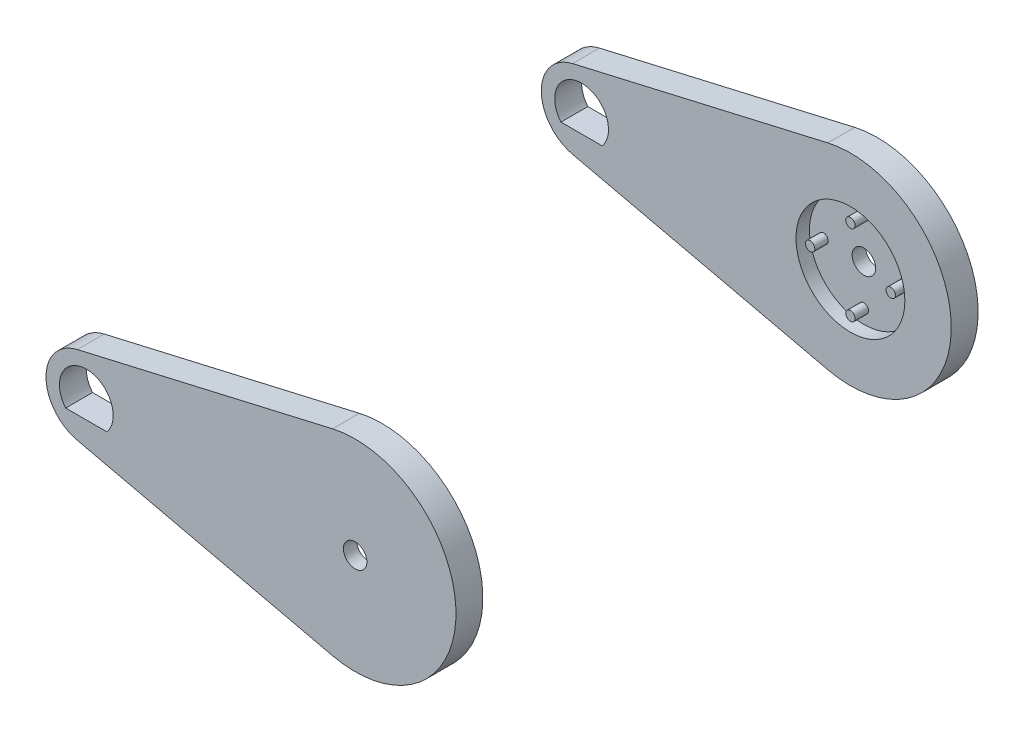
ISO-10303-21;
HEADER;
FILE_DESCRIPTION(('STEP AP214'),'2;1');
FILE_NAME('part.step','',(''),(''),'','','');
FILE_SCHEMA(('AUTOMOTIVE_DESIGN { 1 0 10303 214 1 1 1 1 }'));
ENDSEC;
DATA;
#1=APPLICATION_CONTEXT('core data for automotive mechanical design processes');
#2=APPLICATION_PROTOCOL_DEFINITION('international standard','automotive_design',2000,#1);
#3=PRODUCT_CONTEXT('',#1,'mechanical');
#4=PRODUCT('Part','Part','',(#3));
#5=PRODUCT_RELATED_PRODUCT_CATEGORY('part','',(#4));
#6=PRODUCT_DEFINITION_FORMATION('','',#4);
#7=PRODUCT_DEFINITION_CONTEXT('part definition',#1,'design');
#8=PRODUCT_DEFINITION('design','',#6,#7);
#9=PRODUCT_DEFINITION_SHAPE('','',#8);
#10=(LENGTH_UNIT() NAMED_UNIT(*) SI_UNIT(.MILLI.,.METRE.));
#11=(NAMED_UNIT(*) PLANE_ANGLE_UNIT() SI_UNIT($,.RADIAN.));
#12=(NAMED_UNIT(*) SI_UNIT($,.STERADIAN.) SOLID_ANGLE_UNIT());
#13=UNCERTAINTY_MEASURE_WITH_UNIT(LENGTH_MEASURE(1.E-05),#10,'distance_accuracy_value','');
#14=(GEOMETRIC_REPRESENTATION_CONTEXT(3) GLOBAL_UNCERTAINTY_ASSIGNED_CONTEXT((#13)) GLOBAL_UNIT_ASSIGNED_CONTEXT((#10,
#11,#12)) REPRESENTATION_CONTEXT('',''));
#15=CARTESIAN_POINT('',(0.,0.,0.));
#16=DIRECTION('',(0.,0.,1.));
#17=DIRECTION('',(1.,0.,0.));
#18=AXIS2_PLACEMENT_3D('',#15,#16,#17);
#19=CARTESIAN_POINT('',(0.,0.,73.6959896765683));
#20=DIRECTION('',(0.,0.,1.));
#21=DIRECTION('',(-1.,0.,0.));
#22=AXIS2_PLACEMENT_3D('',#19,#20,#21);
#23=CYLINDRICAL_SURFACE('',#22,15.);
#24=DIRECTION('',(0.,0.,1.));
#25=VECTOR('',#24,1.);
#26=CARTESIAN_POINT('',(-3.375,14.6153814524288,73.6959896765683));
#27=LINE('',#26,#25);
#28=CARTESIAN_POINT('',(-3.375,14.6153814524288,73.6959896765683));
#29=VERTEX_POINT('',#28);
#30=CARTESIAN_POINT('',(-3.375,14.6153814524288,77.6959896765683));
#31=VERTEX_POINT('',#30);
#32=EDGE_CURVE('E112',#29,#31,#27,.T.);
#33=ORIENTED_EDGE('',*,*,#32,.T.);
#34=CARTESIAN_POINT('',(0.,0.,77.6959896765683));
#35=DIRECTION('',(0.,0.,1.));
#36=DIRECTION('',(1.,0.,0.));
#37=AXIS2_PLACEMENT_3D('',#34,#35,#36);
#38=CIRCLE('',#37,15.);
#39=CARTESIAN_POINT('',(-3.375,-14.6153814524288,77.6959896765683));
#40=VERTEX_POINT('',#39);
#41=EDGE_CURVE('E153',#40,#31,#38,.T.);
#42=ORIENTED_EDGE('',*,*,#41,.F.);
#43=DIRECTION('',(0.,0.,1.));
#44=VECTOR('',#43,1.);
#45=CARTESIAN_POINT('',(-3.375,-14.6153814524288,73.6959896765683));
#46=LINE('',#45,#44);
#47=CARTESIAN_POINT('',(-3.375,-14.6153814524288,73.6959896765683));
#48=VERTEX_POINT('',#47);
#49=EDGE_CURVE('E131',#48,#40,#46,.T.);
#50=ORIENTED_EDGE('',*,*,#49,.F.);
#51=CARTESIAN_POINT('',(0.,0.,73.6959896765683));
#52=DIRECTION('',(0.,0.,1.));
#53=DIRECTION('',(1.,0.,0.));
#54=AXIS2_PLACEMENT_3D('',#51,#52,#53);
#55=CIRCLE('',#54,15.);
#56=EDGE_CURVE('E58',#48,#29,#55,.T.);
#57=ORIENTED_EDGE('',*,*,#56,.T.);
#58=EDGE_LOOP('',(#33,#42,#50,#57));
#59=FACE_BOUND('',#58,.T.);
#60=ADVANCED_FACE('F50',(#59),#23,.T.);
#61=CARTESIAN_POINT('',(0.,0.,73.6959896765683));
#62=DIRECTION('',(0.,0.,1.));
#63=DIRECTION('',(-1.,0.,0.));
#64=AXIS2_PLACEMENT_3D('',#61,#62,#63);
#65=CYLINDRICAL_SURFACE('',#64,8.1);
#66=CARTESIAN_POINT('',(0.,0.,75.6959896765683));
#67=DIRECTION('',(0.,0.,1.));
#68=DIRECTION('',(1.,0.,0.));
#69=AXIS2_PLACEMENT_3D('',#66,#67,#68);
#70=CIRCLE('',#69,8.1);
#71=CARTESIAN_POINT('',(8.1,0.,75.6959896765683));
#72=VERTEX_POINT('',#71);
#73=EDGE_CURVE('E12',#72,#72,#70,.T.);
#74=ORIENTED_EDGE('',*,*,#73,.T.);
#75=EDGE_LOOP('',(#74));
#76=FACE_BOUND('',#75,.T.);
#77=CARTESIAN_POINT('',(0.,0.,73.6959896765683));
#78=DIRECTION('',(0.,0.,1.));
#79=DIRECTION('',(1.,0.,0.));
#80=AXIS2_PLACEMENT_3D('',#77,#78,#79);
#81=CIRCLE('',#80,8.1);
#82=CARTESIAN_POINT('',(8.1,0.,73.6959896765683));
#83=VERTEX_POINT('',#82);
#84=EDGE_CURVE('E156',#83,#83,#81,.T.);
#85=ORIENTED_EDGE('',*,*,#84,.F.);
#86=EDGE_LOOP('',(#85));
#87=FACE_BOUND('',#86,.T.);
#88=ADVANCED_FACE('F52',(#76,#87),#65,.F.);
#89=CARTESIAN_POINT('',(0.,0.,73.6959896765683));
#90=DIRECTION('',(0.,0.,-1.));
#91=DIRECTION('',(1.,0.,0.));
#92=AXIS2_PLACEMENT_3D('',#89,#90,#91);
#93=PLANE('',#92);
#94=ORIENTED_EDGE('',*,*,#84,.T.);
#95=EDGE_LOOP('',(#94));
#96=FACE_BOUND('',#95,.T.);
#97=ORIENTED_EDGE('',*,*,#56,.F.);
#98=DIRECTION('',(0.974358763495254,-0.225,0.));
#99=VECTOR('',#98,1.);
#100=CARTESIAN_POINT('',(-3.375,-14.6153814524288,73.6959896765683));
#101=LINE('',#100,#99);
#102=CARTESIAN_POINT('',(-41.35,-5.84615258097153,73.6959896765683));
#103=VERTEX_POINT('',#102);
#104=EDGE_CURVE('E65',#103,#48,#101,.T.);
#105=ORIENTED_EDGE('',*,*,#104,.F.);
#106=CARTESIAN_POINT('',(-40.,0.,73.6959896765683));
#107=DIRECTION('',(0.,0.,1.));
#108=DIRECTION('',(1.,0.,0.));
#109=AXIS2_PLACEMENT_3D('',#106,#107,#108);
#110=CIRCLE('',#109,6.);
#111=CARTESIAN_POINT('',(-41.35,5.84615258097153,73.6959896765683));
#112=VERTEX_POINT('',#111);
#113=EDGE_CURVE('E107',#112,#103,#110,.T.);
#114=ORIENTED_EDGE('',*,*,#113,.F.);
#115=DIRECTION('',(0.974358763495254,0.225,0.));
#116=VECTOR('',#115,1.);
#117=CARTESIAN_POINT('',(-3.375,14.6153814524288,73.6959896765683));
#118=LINE('',#117,#116);
#119=EDGE_CURVE('E72',#112,#29,#118,.T.);
#120=ORIENTED_EDGE('',*,*,#119,.T.);
#121=EDGE_LOOP('',(#97,#105,#114,#120));
#122=FACE_BOUND('',#121,.T.);
#123=CARTESIAN_POINT('',(-40.,0.,73.6959896765683));
#124=DIRECTION('',(0.,0.,1.));
#125=DIRECTION('',(1.,0.,0.));
#126=AXIS2_PLACEMENT_3D('',#123,#124,#125);
#127=CIRCLE('',#126,4.);
#128=CARTESIAN_POINT('',(-36.925,-2.55819760769179,73.6959896765683));
#129=VERTEX_POINT('',#128);
#130=CARTESIAN_POINT('',(-43.075,-2.55819760769179,73.6959896765683));
#131=VERTEX_POINT('',#130);
#132=EDGE_CURVE('E123',#129,#131,#127,.T.);
#133=ORIENTED_EDGE('',*,*,#132,.T.);
#134=DIRECTION('',(1.,0.,0.));
#135=VECTOR('',#134,1.);
#136=CARTESIAN_POINT('',(0.,-2.55819760769179,73.6959896765683));
#137=LINE('',#136,#135);
#138=EDGE_CURVE('E128',#131,#129,#137,.T.);
#139=ORIENTED_EDGE('',*,*,#138,.T.);
#140=EDGE_LOOP('',(#133,#139));
#141=FACE_BOUND('',#140,.T.);
#142=ADVANCED_FACE('F120',(#96,#122,#141),#93,.T.);
#143=CARTESIAN_POINT('',(0.,0.,77.6959896765683));
#144=DIRECTION('',(0.,0.,-1.));
#145=DIRECTION('',(1.,0.,0.));
#146=AXIS2_PLACEMENT_3D('',#143,#144,#145);
#147=PLANE('',#146);
#148=ORIENTED_EDGE('',*,*,#41,.T.);
#149=DIRECTION('',(0.974358763495254,0.225,0.));
#150=VECTOR('',#149,1.);
#151=CARTESIAN_POINT('',(-3.375,14.6153814524288,77.6959896765683));
#152=LINE('',#151,#150);
#153=CARTESIAN_POINT('',(-41.35,5.84615258097153,77.6959896765683));
#154=VERTEX_POINT('',#153);
#155=EDGE_CURVE('E132',#154,#31,#152,.T.);
#156=ORIENTED_EDGE('',*,*,#155,.F.);
#157=CARTESIAN_POINT('',(-40.,0.,77.6959896765683));
#158=DIRECTION('',(0.,0.,1.));
#159=DIRECTION('',(1.,0.,0.));
#160=AXIS2_PLACEMENT_3D('',#157,#158,#159);
#161=CIRCLE('',#160,6.);
#162=CARTESIAN_POINT('',(-41.35,-5.84615258097153,77.6959896765683));
#163=VERTEX_POINT('',#162);
#164=EDGE_CURVE('E109',#154,#163,#161,.T.);
#165=ORIENTED_EDGE('',*,*,#164,.T.);
#166=DIRECTION('',(0.974358763495254,-0.225,0.));
#167=VECTOR('',#166,1.);
#168=CARTESIAN_POINT('',(-3.375,-14.6153814524288,77.6959896765683));
#169=LINE('',#168,#167);
#170=EDGE_CURVE('E135',#163,#40,#169,.T.);
#171=ORIENTED_EDGE('',*,*,#170,.T.);
#172=EDGE_LOOP('',(#148,#156,#165,#171));
#173=FACE_BOUND('',#172,.T.);
#174=CARTESIAN_POINT('',(0.,0.,77.6959896765683));
#175=DIRECTION('',(0.,0.,1.));
#176=DIRECTION('',(1.,0.,0.));
#177=AXIS2_PLACEMENT_3D('',#174,#175,#176);
#178=CIRCLE('',#177,1.75);
#179=CARTESIAN_POINT('',(1.75,0.,77.6959896765683));
#180=VERTEX_POINT('',#179);
#181=EDGE_CURVE('E146',#180,#180,#178,.T.);
#182=ORIENTED_EDGE('',*,*,#181,.F.);
#183=EDGE_LOOP('',(#182));
#184=FACE_BOUND('',#183,.T.);
#185=CARTESIAN_POINT('',(-40.,0.,77.6959896765683));
#186=DIRECTION('',(0.,0.,1.));
#187=DIRECTION('',(1.,0.,0.));
#188=AXIS2_PLACEMENT_3D('',#185,#186,#187);
#189=CIRCLE('',#188,4.);
#190=CARTESIAN_POINT('',(-36.925,-2.55819760769179,77.6959896765683));
#191=VERTEX_POINT('',#190);
#192=CARTESIAN_POINT('',(-43.075,-2.55819760769179,77.6959896765683));
#193=VERTEX_POINT('',#192);
#194=EDGE_CURVE('E137',#191,#193,#189,.T.);
#195=ORIENTED_EDGE('',*,*,#194,.F.);
#196=DIRECTION('',(1.,0.,0.));
#197=VECTOR('',#196,1.);
#198=CARTESIAN_POINT('',(0.,-2.55819760769179,77.6959896765683));
#199=LINE('',#198,#197);
#200=EDGE_CURVE('E118',#193,#191,#199,.T.);
#201=ORIENTED_EDGE('',*,*,#200,.F.);
#202=EDGE_LOOP('',(#195,#201));
#203=FACE_BOUND('',#202,.T.);
#204=ADVANCED_FACE('F162',(#173,#184,#203),#147,.F.);
#205=CARTESIAN_POINT('',(0.,0.,75.6959896765683));
#206=DIRECTION('',(0.,0.,1.));
#207=DIRECTION('',(-1.,0.,0.));
#208=AXIS2_PLACEMENT_3D('',#205,#206,#207);
#209=CYLINDRICAL_SURFACE('',#208,1.75);
#210=CARTESIAN_POINT('',(0.,0.,75.6959896765683));
#211=DIRECTION('',(0.,0.,1.));
#212=DIRECTION('',(1.,0.,0.));
#213=AXIS2_PLACEMENT_3D('',#210,#211,#212);
#214=CIRCLE('',#213,1.75);
#215=CARTESIAN_POINT('',(1.75,0.,75.6959896765683));
#216=VERTEX_POINT('',#215);
#217=EDGE_CURVE('E150',#216,#216,#214,.T.);
#218=ORIENTED_EDGE('',*,*,#217,.F.);
#219=EDGE_LOOP('',(#218));
#220=FACE_BOUND('',#219,.T.);
#221=ORIENTED_EDGE('',*,*,#181,.T.);
#222=EDGE_LOOP('',(#221));
#223=FACE_BOUND('',#222,.T.);
#224=ADVANCED_FACE('F187',(#220,#223),#209,.F.);
#225=CARTESIAN_POINT('',(0.,0.,75.6959896765683));
#226=DIRECTION('',(0.,0.,-1.));
#227=DIRECTION('',(1.,0.,0.));
#228=AXIS2_PLACEMENT_3D('',#225,#226,#227);
#229=PLANE('',#228);
#230=ORIENTED_EDGE('',*,*,#217,.T.);
#231=EDGE_LOOP('',(#230));
#232=FACE_BOUND('',#231,.T.);
#233=ORIENTED_EDGE('',*,*,#73,.F.);
#234=EDGE_LOOP('',(#233));
#235=FACE_BOUND('',#234,.T.);
#236=ADVANCED_FACE('F193',(#232,#235),#229,.T.);
#237=CARTESIAN_POINT('',(-40.,0.,73.6959896765683));
#238=DIRECTION('',(0.,0.,1.));
#239=DIRECTION('',(-1.,0.,0.));
#240=AXIS2_PLACEMENT_3D('',#237,#238,#239);
#241=CYLINDRICAL_SURFACE('',#240,4.);
#242=ORIENTED_EDGE('',*,*,#194,.T.);
#243=DIRECTION('',(0.,0.,1.));
#244=VECTOR('',#243,1.);
#245=CARTESIAN_POINT('',(-43.075,-2.55819760769179,73.6959896765683));
#246=LINE('',#245,#244);
#247=EDGE_CURVE('E142',#131,#193,#246,.T.);
#248=ORIENTED_EDGE('',*,*,#247,.F.);
#249=ORIENTED_EDGE('',*,*,#132,.F.);
#250=DIRECTION('',(0.,0.,1.));
#251=VECTOR('',#250,1.);
#252=CARTESIAN_POINT('',(-36.925,-2.55819760769179,73.6959896765683));
#253=LINE('',#252,#251);
#254=EDGE_CURVE('E144',#129,#191,#253,.T.);
#255=ORIENTED_EDGE('',*,*,#254,.T.);
#256=EDGE_LOOP('',(#242,#248,#249,#255));
#257=FACE_BOUND('',#256,.T.);
#258=ADVANCED_FACE('F197',(#257),#241,.F.);
#259=CARTESIAN_POINT('',(-3.375,14.6153814524288,73.6959896765683));
#260=DIRECTION('',(-0.225,0.974358763495254,0.));
#261=DIRECTION('',(-0.974358763495254,-0.225,0.));
#262=AXIS2_PLACEMENT_3D('',#259,#260,#261);
#263=PLANE('',#262);
#264=ORIENTED_EDGE('',*,*,#155,.T.);
#265=ORIENTED_EDGE('',*,*,#32,.F.);
#266=ORIENTED_EDGE('',*,*,#119,.F.);
#267=DIRECTION('',(0.,0.,1.));
#268=VECTOR('',#267,1.);
#269=CARTESIAN_POINT('',(-41.35,5.84615258097153,73.6959896765683));
#270=LINE('',#269,#268);
#271=EDGE_CURVE('E105',#112,#154,#270,.T.);
#272=ORIENTED_EDGE('',*,*,#271,.T.);
#273=EDGE_LOOP('',(#264,#265,#266,#272));
#274=FACE_BOUND('',#273,.T.);
#275=ADVANCED_FACE('F116',(#274),#263,.T.);
#276=CARTESIAN_POINT('',(-40.,0.,73.6959896765683));
#277=DIRECTION('',(0.,0.,1.));
#278=DIRECTION('',(-1.,0.,0.));
#279=AXIS2_PLACEMENT_3D('',#276,#277,#278);
#280=CYLINDRICAL_SURFACE('',#279,6.);
#281=ORIENTED_EDGE('',*,*,#164,.F.);
#282=ORIENTED_EDGE('',*,*,#271,.F.);
#283=ORIENTED_EDGE('',*,*,#113,.T.);
#284=DIRECTION('',(0.,0.,1.));
#285=VECTOR('',#284,1.);
#286=CARTESIAN_POINT('',(-41.35,-5.84615258097153,73.6959896765683));
#287=LINE('',#286,#285);
#288=EDGE_CURVE('E113',#103,#163,#287,.T.);
#289=ORIENTED_EDGE('',*,*,#288,.T.);
#290=EDGE_LOOP('',(#281,#282,#283,#289));
#291=FACE_BOUND('',#290,.T.);
#292=ADVANCED_FACE('F106',(#291),#280,.T.);
#293=CARTESIAN_POINT('',(-3.375,-14.6153814524288,73.6959896765683));
#294=DIRECTION('',(0.225,0.974358763495254,0.));
#295=DIRECTION('',(-0.974358763495254,0.225,0.));
#296=AXIS2_PLACEMENT_3D('',#293,#294,#295);
#297=PLANE('',#296);
#298=ORIENTED_EDGE('',*,*,#170,.F.);
#299=ORIENTED_EDGE('',*,*,#288,.F.);
#300=ORIENTED_EDGE('',*,*,#104,.T.);
#301=ORIENTED_EDGE('',*,*,#49,.T.);
#302=EDGE_LOOP('',(#298,#299,#300,#301));
#303=FACE_BOUND('',#302,.T.);
#304=ADVANCED_FACE('F167',(#303),#297,.F.);
#305=CARTESIAN_POINT('',(0.,-2.55819760769179,73.6959896765683));
#306=DIRECTION('',(0.,1.,0.));
#307=DIRECTION('',(0.,0.,-1.));
#308=AXIS2_PLACEMENT_3D('',#305,#306,#307);
#309=PLANE('',#308);
#310=ORIENTED_EDGE('',*,*,#200,.T.);
#311=ORIENTED_EDGE('',*,*,#254,.F.);
#312=ORIENTED_EDGE('',*,*,#138,.F.);
#313=ORIENTED_EDGE('',*,*,#247,.T.);
#314=EDGE_LOOP('',(#310,#311,#312,#313));
#315=FACE_BOUND('',#314,.T.);
#316=ADVANCED_FACE('F169',(#315),#309,.T.);
#317=CLOSED_SHELL('',(#60,#88,#142,#204,#224,#236,#258,#275,#292,#304,#316));
#318=MANIFOLD_SOLID_BREP('B2_NOT_SHOWN',#317);
#319=CARTESIAN_POINT('',(0.,0.,4.));
#320=DIRECTION('',(0.,0.,-1.));
#321=DIRECTION('',(-1.,0.,0.));
#322=AXIS2_PLACEMENT_3D('',#319,#320,#321);
#323=CYLINDRICAL_SURFACE('',#322,15.);
#324=DIRECTION('',(0.,0.,-1.));
#325=VECTOR('',#324,1.);
#326=CARTESIAN_POINT('',(-3.375,14.6153814524288,4.));
#327=LINE('',#326,#325);
#328=CARTESIAN_POINT('',(-3.375,14.6153814524288,4.));
#329=VERTEX_POINT('',#328);
#330=CARTESIAN_POINT('',(-3.375,14.6153814524288,0.));
#331=VERTEX_POINT('',#330);
#332=EDGE_CURVE('E337',#329,#331,#327,.T.);
#333=ORIENTED_EDGE('',*,*,#332,.F.);
#334=CARTESIAN_POINT('',(0.,0.,4.));
#335=DIRECTION('',(0.,0.,1.));
#336=DIRECTION('',(1.,0.,0.));
#337=AXIS2_PLACEMENT_3D('',#334,#335,#336);
#338=CIRCLE('',#337,15.);
#339=CARTESIAN_POINT('',(-3.375,-14.6153814524288,4.));
#340=VERTEX_POINT('',#339);
#341=EDGE_CURVE('E326',#340,#329,#338,.T.);
#342=ORIENTED_EDGE('',*,*,#341,.F.);
#343=DIRECTION('',(0.,0.,-1.));
#344=VECTOR('',#343,1.);
#345=CARTESIAN_POINT('',(-3.375,-14.6153814524288,4.));
#346=LINE('',#345,#344);
#347=CARTESIAN_POINT('',(-3.375,-14.6153814524288,0.));
#348=VERTEX_POINT('',#347);
#349=EDGE_CURVE('E406',#340,#348,#346,.T.);
#350=ORIENTED_EDGE('',*,*,#349,.T.);
#351=CARTESIAN_POINT('',(0.,0.,0.));
#352=DIRECTION('',(0.,0.,1.));
#353=DIRECTION('',(1.,0.,0.));
#354=AXIS2_PLACEMENT_3D('',#351,#352,#353);
#355=CIRCLE('',#354,15.);
#356=EDGE_CURVE('E426',#348,#331,#355,.T.);
#357=ORIENTED_EDGE('',*,*,#356,.T.);
#358=EDGE_LOOP('',(#333,#342,#350,#357));
#359=FACE_BOUND('',#358,.T.);
#360=ADVANCED_FACE('F318',(#359),#323,.T.);
#361=CARTESIAN_POINT('',(0.,0.,4.));
#362=DIRECTION('',(0.,0.,-1.));
#363=DIRECTION('',(-1.,0.,0.));
#364=AXIS2_PLACEMENT_3D('',#361,#362,#363);
#365=CYLINDRICAL_SURFACE('',#364,8.1);
#366=CARTESIAN_POINT('',(0.,0.,2.));
#367=DIRECTION('',(0.,0.,1.));
#368=DIRECTION('',(1.,0.,0.));
#369=AXIS2_PLACEMENT_3D('',#366,#367,#368);
#370=CIRCLE('',#369,8.1);
#371=CARTESIAN_POINT('',(8.1,0.,2.));
#372=VERTEX_POINT('',#371);
#373=EDGE_CURVE('E48',#372,#372,#370,.T.);
#374=ORIENTED_EDGE('',*,*,#373,.F.);
#375=EDGE_LOOP('',(#374));
#376=FACE_BOUND('',#375,.T.);
#377=CARTESIAN_POINT('',(0.,0.,4.));
#378=DIRECTION('',(0.,0.,1.));
#379=DIRECTION('',(1.,0.,0.));
#380=AXIS2_PLACEMENT_3D('',#377,#378,#379);
#381=CIRCLE('',#380,8.1);
#382=CARTESIAN_POINT('',(8.1,0.,4.));
#383=VERTEX_POINT('',#382);
#384=EDGE_CURVE('E429',#383,#383,#381,.T.);
#385=ORIENTED_EDGE('',*,*,#384,.T.);
#386=EDGE_LOOP('',(#385));
#387=FACE_BOUND('',#386,.T.);
#388=ADVANCED_FACE('F320',(#376,#387),#365,.F.);
#389=CARTESIAN_POINT('',(0.,0.,4.));
#390=DIRECTION('',(0.,0.,1.));
#391=DIRECTION('',(1.,0.,0.));
#392=AXIS2_PLACEMENT_3D('',#389,#390,#391);
#393=PLANE('',#392);
#394=ORIENTED_EDGE('',*,*,#384,.F.);
#395=EDGE_LOOP('',(#394));
#396=FACE_BOUND('',#395,.T.);
#397=ORIENTED_EDGE('',*,*,#341,.T.);
#398=DIRECTION('',(0.974358763495254,0.225,0.));
#399=VECTOR('',#398,1.);
#400=CARTESIAN_POINT('',(-3.375,14.6153814524288,4.));
#401=LINE('',#400,#399);
#402=CARTESIAN_POINT('',(-41.35,5.84615258097153,4.));
#403=VERTEX_POINT('',#402);
#404=EDGE_CURVE('E373',#403,#329,#401,.T.);
#405=ORIENTED_EDGE('',*,*,#404,.F.);
#406=CARTESIAN_POINT('',(-40.,0.,4.));
#407=DIRECTION('',(0.,0.,1.));
#408=DIRECTION('',(1.,0.,0.));
#409=AXIS2_PLACEMENT_3D('',#406,#407,#408);
#410=CIRCLE('',#409,6.);
#411=CARTESIAN_POINT('',(-41.35,-5.84615258097153,4.));
#412=VERTEX_POINT('',#411);
#413=EDGE_CURVE('E381',#403,#412,#410,.T.);
#414=ORIENTED_EDGE('',*,*,#413,.T.);
#415=DIRECTION('',(0.974358763495254,-0.225,0.));
#416=VECTOR('',#415,1.);
#417=CARTESIAN_POINT('',(-3.375,-14.6153814524288,4.));
#418=LINE('',#417,#416);
#419=EDGE_CURVE('E386',#412,#340,#418,.T.);
#420=ORIENTED_EDGE('',*,*,#419,.T.);
#421=EDGE_LOOP('',(#397,#405,#414,#420));
#422=FACE_BOUND('',#421,.T.);
#423=CARTESIAN_POINT('',(-40.,0.,4.));
#424=DIRECTION('',(0.,0.,1.));
#425=DIRECTION('',(1.,0.,0.));
#426=AXIS2_PLACEMENT_3D('',#423,#424,#425);
#427=CIRCLE('',#426,4.);
#428=CARTESIAN_POINT('',(-36.925,-2.55819760769179,4.));
#429=VERTEX_POINT('',#428);
#430=CARTESIAN_POINT('',(-43.075,-2.55819760769179,4.));
#431=VERTEX_POINT('',#430);
#432=EDGE_CURVE('E400',#429,#431,#427,.T.);
#433=ORIENTED_EDGE('',*,*,#432,.F.);
#434=DIRECTION('',(1.,0.,0.));
#435=VECTOR('',#434,1.);
#436=CARTESIAN_POINT('',(0.,-2.55819760769179,4.));
#437=LINE('',#436,#435);
#438=EDGE_CURVE('E403',#431,#429,#437,.T.);
#439=ORIENTED_EDGE('',*,*,#438,.F.);
#440=EDGE_LOOP('',(#433,#439));
#441=FACE_BOUND('',#440,.T.);
#442=ADVANCED_FACE('F388',(#396,#422,#441),#393,.T.);
#443=CARTESIAN_POINT('',(0.,0.,0.));
#444=DIRECTION('',(0.,0.,1.));
#445=DIRECTION('',(1.,0.,0.));
#446=AXIS2_PLACEMENT_3D('',#443,#444,#445);
#447=PLANE('',#446);
#448=ORIENTED_EDGE('',*,*,#356,.F.);
#449=DIRECTION('',(0.974358763495254,-0.225,0.));
#450=VECTOR('',#449,1.);
#451=CARTESIAN_POINT('',(-3.375,-14.6153814524288,0.));
#452=LINE('',#451,#450);
#453=CARTESIAN_POINT('',(-41.35,-5.84615258097153,0.));
#454=VERTEX_POINT('',#453);
#455=EDGE_CURVE('E410',#454,#348,#452,.T.);
#456=ORIENTED_EDGE('',*,*,#455,.F.);
#457=CARTESIAN_POINT('',(-40.,0.,0.));
#458=DIRECTION('',(0.,0.,1.));
#459=DIRECTION('',(1.,0.,0.));
#460=AXIS2_PLACEMENT_3D('',#457,#458,#459);
#461=CIRCLE('',#460,6.);
#462=CARTESIAN_POINT('',(-41.35,5.84615258097153,0.));
#463=VERTEX_POINT('',#462);
#464=EDGE_CURVE('E408',#463,#454,#461,.T.);
#465=ORIENTED_EDGE('',*,*,#464,.F.);
#466=DIRECTION('',(0.974358763495254,0.225,0.));
#467=VECTOR('',#466,1.);
#468=CARTESIAN_POINT('',(-3.375,14.6153814524288,0.));
#469=LINE('',#468,#467);
#470=EDGE_CURVE('E375',#463,#331,#469,.T.);
#471=ORIENTED_EDGE('',*,*,#470,.T.);
#472=EDGE_LOOP('',(#448,#456,#465,#471));
#473=FACE_BOUND('',#472,.T.);
#474=CARTESIAN_POINT('',(0.,0.,0.));
#475=DIRECTION('',(0.,0.,1.));
#476=DIRECTION('',(1.,0.,0.));
#477=AXIS2_PLACEMENT_3D('',#474,#475,#476);
#478=CIRCLE('',#477,1.75);
#479=CARTESIAN_POINT('',(1.75,0.,0.));
#480=VERTEX_POINT('',#479);
#481=EDGE_CURVE('E419',#480,#480,#478,.T.);
#482=ORIENTED_EDGE('',*,*,#481,.T.);
#483=EDGE_LOOP('',(#482));
#484=FACE_BOUND('',#483,.T.);
#485=CARTESIAN_POINT('',(-40.,0.,0.));
#486=DIRECTION('',(0.,0.,1.));
#487=DIRECTION('',(1.,0.,0.));
#488=AXIS2_PLACEMENT_3D('',#485,#486,#487);
#489=CIRCLE('',#488,4.);
#490=CARTESIAN_POINT('',(-36.925,-2.55819760769179,0.));
#491=VERTEX_POINT('',#490);
#492=CARTESIAN_POINT('',(-43.075,-2.55819760769179,0.));
#493=VERTEX_POINT('',#492);
#494=EDGE_CURVE('E393',#491,#493,#489,.T.);
#495=ORIENTED_EDGE('',*,*,#494,.T.);
#496=DIRECTION('',(1.,0.,0.));
#497=VECTOR('',#496,1.);
#498=CARTESIAN_POINT('',(0.,-2.55819760769179,0.));
#499=LINE('',#498,#497);
#500=EDGE_CURVE('E390',#493,#491,#499,.T.);
#501=ORIENTED_EDGE('',*,*,#500,.T.);
#502=EDGE_LOOP('',(#495,#501));
#503=FACE_BOUND('',#502,.T.);
#504=ADVANCED_FACE('F435',(#473,#484,#503),#447,.F.);
#505=CARTESIAN_POINT('',(0.,0.,2.));
#506=DIRECTION('',(0.,0.,-1.));
#507=DIRECTION('',(-1.,0.,0.));
#508=AXIS2_PLACEMENT_3D('',#505,#506,#507);
#509=CYLINDRICAL_SURFACE('',#508,1.75);
#510=CARTESIAN_POINT('',(0.,0.,2.));
#511=DIRECTION('',(0.,0.,1.));
#512=DIRECTION('',(1.,0.,0.));
#513=AXIS2_PLACEMENT_3D('',#510,#511,#512);
#514=CIRCLE('',#513,1.75);
#515=CARTESIAN_POINT('',(1.75,0.,2.));
#516=VERTEX_POINT('',#515);
#517=EDGE_CURVE('E423',#516,#516,#514,.T.);
#518=ORIENTED_EDGE('',*,*,#517,.T.);
#519=EDGE_LOOP('',(#518));
#520=FACE_BOUND('',#519,.T.);
#521=ORIENTED_EDGE('',*,*,#481,.F.);
#522=EDGE_LOOP('',(#521));
#523=FACE_BOUND('',#522,.T.);
#524=ADVANCED_FACE('F459',(#520,#523),#509,.F.);
#525=CARTESIAN_POINT('',(0.,0.,2.));
#526=DIRECTION('',(0.,0.,1.));
#527=DIRECTION('',(1.,0.,0.));
#528=AXIS2_PLACEMENT_3D('',#525,#526,#527);
#529=PLANE('',#528);
#530=CARTESIAN_POINT('',(-6.,0.,2.));
#531=DIRECTION('',(0.,0.,1.));
#532=DIRECTION('',(1.,0.,0.));
#533=AXIS2_PLACEMENT_3D('',#530,#531,#532);
#534=CIRCLE('',#533,0.7);
#535=CARTESIAN_POINT('',(-5.3,0.,2.));
#536=VERTEX_POINT('',#535);
#537=EDGE_CURVE('E515',#536,#536,#534,.T.);
#538=ORIENTED_EDGE('',*,*,#537,.F.);
#539=EDGE_LOOP('',(#538));
#540=FACE_BOUND('',#539,.T.);
#541=CARTESIAN_POINT('',(0.,-6.,2.));
#542=DIRECTION('',(0.,0.,1.));
#543=DIRECTION('',(1.,0.,0.));
#544=AXIS2_PLACEMENT_3D('',#541,#542,#543);
#545=CIRCLE('',#544,0.7);
#546=CARTESIAN_POINT('',(0.7,-6.,2.));
#547=VERTEX_POINT('',#546);
#548=EDGE_CURVE('E519',#547,#547,#545,.T.);
#549=ORIENTED_EDGE('',*,*,#548,.F.);
#550=EDGE_LOOP('',(#549));
#551=FACE_BOUND('',#550,.T.);
#552=CARTESIAN_POINT('',(6.,0.,2.));
#553=DIRECTION('',(0.,0.,1.));
#554=DIRECTION('',(1.,0.,0.));
#555=AXIS2_PLACEMENT_3D('',#552,#553,#554);
#556=CIRCLE('',#555,0.7);
#557=CARTESIAN_POINT('',(6.7,0.,2.));
#558=VERTEX_POINT('',#557);
#559=EDGE_CURVE('E528',#558,#558,#556,.T.);
#560=ORIENTED_EDGE('',*,*,#559,.F.);
#561=EDGE_LOOP('',(#560));
#562=FACE_BOUND('',#561,.T.);
#563=CARTESIAN_POINT('',(0.,6.,2.));
#564=DIRECTION('',(0.,0.,1.));
#565=DIRECTION('',(1.,0.,0.));
#566=AXIS2_PLACEMENT_3D('',#563,#564,#565);
#567=CIRCLE('',#566,0.7);
#568=CARTESIAN_POINT('',(0.7,6.,2.));
#569=VERTEX_POINT('',#568);
#570=EDGE_CURVE('E533',#569,#569,#567,.T.);
#571=ORIENTED_EDGE('',*,*,#570,.F.);
#572=EDGE_LOOP('',(#571));
#573=FACE_BOUND('',#572,.T.);
#574=ORIENTED_EDGE('',*,*,#517,.F.);
#575=EDGE_LOOP('',(#574));
#576=FACE_BOUND('',#575,.T.);
#577=ORIENTED_EDGE('',*,*,#373,.T.);
#578=EDGE_LOOP('',(#577));
#579=FACE_BOUND('',#578,.T.);
#580=ADVANCED_FACE('F465',(#540,#551,#562,#573,#576,#579),#529,.T.);
#581=CARTESIAN_POINT('',(-40.,0.,4.));
#582=DIRECTION('',(0.,0.,-1.));
#583=DIRECTION('',(-1.,0.,0.));
#584=AXIS2_PLACEMENT_3D('',#581,#582,#583);
#585=CYLINDRICAL_SURFACE('',#584,4.);
#586=ORIENTED_EDGE('',*,*,#494,.F.);
#587=DIRECTION('',(0.,0.,-1.));
#588=VECTOR('',#587,1.);
#589=CARTESIAN_POINT('',(-36.925,-2.55819760769179,4.));
#590=LINE('',#589,#588);
#591=EDGE_CURVE('E417',#429,#491,#590,.T.);
#592=ORIENTED_EDGE('',*,*,#591,.F.);
#593=ORIENTED_EDGE('',*,*,#432,.T.);
#594=DIRECTION('',(0.,0.,-1.));
#595=VECTOR('',#594,1.);
#596=CARTESIAN_POINT('',(-43.075,-2.55819760769179,4.));
#597=LINE('',#596,#595);
#598=EDGE_CURVE('E415',#431,#493,#597,.T.);
#599=ORIENTED_EDGE('',*,*,#598,.T.);
#600=EDGE_LOOP('',(#586,#592,#593,#599));
#601=FACE_BOUND('',#600,.T.);
#602=ADVANCED_FACE('F469',(#601),#585,.F.);
#603=CARTESIAN_POINT('',(-3.375,14.6153814524288,4.));
#604=DIRECTION('',(-0.225,0.974358763495254,0.));
#605=DIRECTION('',(-0.974358763495254,-0.225,0.));
#606=AXIS2_PLACEMENT_3D('',#603,#604,#605);
#607=PLANE('',#606);
#608=ORIENTED_EDGE('',*,*,#470,.F.);
#609=DIRECTION('',(0.,0.,-1.));
#610=VECTOR('',#609,1.);
#611=CARTESIAN_POINT('',(-41.35,5.84615258097153,4.));
#612=LINE('',#611,#610);
#613=EDGE_CURVE('E369',#403,#463,#612,.T.);
#614=ORIENTED_EDGE('',*,*,#613,.F.);
#615=ORIENTED_EDGE('',*,*,#404,.T.);
#616=ORIENTED_EDGE('',*,*,#332,.T.);
#617=EDGE_LOOP('',(#608,#614,#615,#616));
#618=FACE_BOUND('',#617,.T.);
#619=ADVANCED_FACE('F371',(#618),#607,.T.);
#620=CARTESIAN_POINT('',(-40.,0.,4.));
#621=DIRECTION('',(0.,0.,-1.));
#622=DIRECTION('',(-1.,0.,0.));
#623=AXIS2_PLACEMENT_3D('',#620,#621,#622);
#624=CYLINDRICAL_SURFACE('',#623,6.);
#625=ORIENTED_EDGE('',*,*,#464,.T.);
#626=DIRECTION('',(0.,0.,-1.));
#627=VECTOR('',#626,1.);
#628=CARTESIAN_POINT('',(-41.35,-5.84615258097153,4.));
#629=LINE('',#628,#627);
#630=EDGE_CURVE('E378',#412,#454,#629,.T.);
#631=ORIENTED_EDGE('',*,*,#630,.F.);
#632=ORIENTED_EDGE('',*,*,#413,.F.);
#633=ORIENTED_EDGE('',*,*,#613,.T.);
#634=EDGE_LOOP('',(#625,#631,#632,#633));
#635=FACE_BOUND('',#634,.T.);
#636=ADVANCED_FACE('F382',(#635),#624,.T.);
#637=CARTESIAN_POINT('',(-3.375,-14.6153814524288,4.));
#638=DIRECTION('',(0.225,0.974358763495254,0.));
#639=DIRECTION('',(-0.974358763495254,0.225,0.));
#640=AXIS2_PLACEMENT_3D('',#637,#638,#639);
#641=PLANE('',#640);
#642=ORIENTED_EDGE('',*,*,#455,.T.);
#643=ORIENTED_EDGE('',*,*,#349,.F.);
#644=ORIENTED_EDGE('',*,*,#419,.F.);
#645=ORIENTED_EDGE('',*,*,#630,.T.);
#646=EDGE_LOOP('',(#642,#643,#644,#645));
#647=FACE_BOUND('',#646,.T.);
#648=ADVANCED_FACE('F438',(#647),#641,.F.);
#649=CARTESIAN_POINT('',(0.,-2.55819760769179,4.));
#650=DIRECTION('',(0.,1.,0.));
#651=DIRECTION('',(0.,0.,1.));
#652=AXIS2_PLACEMENT_3D('',#649,#650,#651);
#653=PLANE('',#652);
#654=ORIENTED_EDGE('',*,*,#500,.F.);
#655=ORIENTED_EDGE('',*,*,#598,.F.);
#656=ORIENTED_EDGE('',*,*,#438,.T.);
#657=ORIENTED_EDGE('',*,*,#591,.T.);
#658=EDGE_LOOP('',(#654,#655,#656,#657));
#659=FACE_BOUND('',#658,.T.);
#660=ADVANCED_FACE('F440',(#659),#653,.T.);
#661=CARTESIAN_POINT('',(0.,6.,5.97989898732233));
#662=DIRECTION('',(0.,0.,-1.));
#663=DIRECTION('',(-1.,0.,0.));
#664=AXIS2_PLACEMENT_3D('',#661,#662,#663);
#665=CYLINDRICAL_SURFACE('',#664,0.7);
#666=ORIENTED_EDGE('',*,*,#570,.T.);
#667=EDGE_LOOP('',(#666));
#668=FACE_BOUND('',#667,.T.);
#669=CARTESIAN_POINT('',(0.,6.,4.));
#670=DIRECTION('',(0.,0.,1.));
#671=DIRECTION('',(1.,0.,0.));
#672=AXIS2_PLACEMENT_3D('',#669,#670,#671);
#673=CIRCLE('',#672,0.7);
#674=CARTESIAN_POINT('',(0.7,6.,4.));
#675=VERTEX_POINT('',#674);
#676=EDGE_CURVE('E396',#675,#675,#673,.T.);
#677=ORIENTED_EDGE('',*,*,#676,.F.);
#678=EDGE_LOOP('',(#677));
#679=FACE_BOUND('',#678,.T.);
#680=ADVANCED_FACE('F446',(#668,#679),#665,.T.);
#681=CARTESIAN_POINT('',(0.,0.,4.));
#682=DIRECTION('',(0.,0.,1.));
#683=DIRECTION('',(1.,0.,0.));
#684=AXIS2_PLACEMENT_3D('',#681,#682,#683);
#685=PLANE('',#684);
#686=ORIENTED_EDGE('',*,*,#676,.T.);
#687=EDGE_LOOP('',(#686));
#688=FACE_BOUND('',#687,.T.);
#689=ADVANCED_FACE('F480',(#688),#685,.T.);
#690=CARTESIAN_POINT('',(6.,0.,5.97989898732233));
#691=DIRECTION('',(0.,0.,-1.));
#692=DIRECTION('',(-1.,0.,0.));
#693=AXIS2_PLACEMENT_3D('',#690,#691,#692);
#694=CYLINDRICAL_SURFACE('',#693,0.7);
#695=ORIENTED_EDGE('',*,*,#559,.T.);
#696=EDGE_LOOP('',(#695));
#697=FACE_BOUND('',#696,.T.);
#698=CARTESIAN_POINT('',(6.,0.,4.));
#699=DIRECTION('',(0.,0.,1.));
#700=DIRECTION('',(1.,0.,0.));
#701=AXIS2_PLACEMENT_3D('',#698,#699,#700);
#702=CIRCLE('',#701,0.7);
#703=CARTESIAN_POINT('',(6.7,0.,4.));
#704=VERTEX_POINT('',#703);
#705=EDGE_CURVE('E531',#704,#704,#702,.T.);
#706=ORIENTED_EDGE('',*,*,#705,.F.);
#707=EDGE_LOOP('',(#706));
#708=FACE_BOUND('',#707,.T.);
#709=ADVANCED_FACE('F483',(#697,#708),#694,.T.);
#710=CARTESIAN_POINT('',(0.,0.,4.));
#711=DIRECTION('',(0.,0.,1.));
#712=DIRECTION('',(1.,0.,0.));
#713=AXIS2_PLACEMENT_3D('',#710,#711,#712);
#714=PLANE('',#713);
#715=ORIENTED_EDGE('',*,*,#705,.T.);
#716=EDGE_LOOP('',(#715));
#717=FACE_BOUND('',#716,.T.);
#718=ADVANCED_FACE('F488',(#717),#714,.T.);
#719=CARTESIAN_POINT('',(0.,-6.,5.97989898732233));
#720=DIRECTION('',(0.,0.,-1.));
#721=DIRECTION('',(-1.,0.,0.));
#722=AXIS2_PLACEMENT_3D('',#719,#720,#721);
#723=CYLINDRICAL_SURFACE('',#722,0.7);
#724=ORIENTED_EDGE('',*,*,#548,.T.);
#725=EDGE_LOOP('',(#724));
#726=FACE_BOUND('',#725,.T.);
#727=CARTESIAN_POINT('',(0.,-6.,4.));
#728=DIRECTION('',(0.,0.,1.));
#729=DIRECTION('',(1.,0.,0.));
#730=AXIS2_PLACEMENT_3D('',#727,#728,#729);
#731=CIRCLE('',#730,0.7);
#732=CARTESIAN_POINT('',(0.7,-6.,4.));
#733=VERTEX_POINT('',#732);
#734=EDGE_CURVE('E522',#733,#733,#731,.T.);
#735=ORIENTED_EDGE('',*,*,#734,.F.);
#736=EDGE_LOOP('',(#735));
#737=FACE_BOUND('',#736,.T.);
#738=ADVANCED_FACE('F491',(#726,#737),#723,.T.);
#739=CARTESIAN_POINT('',(0.,0.,4.));
#740=DIRECTION('',(0.,0.,1.));
#741=DIRECTION('',(1.,0.,0.));
#742=AXIS2_PLACEMENT_3D('',#739,#740,#741);
#743=PLANE('',#742);
#744=ORIENTED_EDGE('',*,*,#734,.T.);
#745=EDGE_LOOP('',(#744));
#746=FACE_BOUND('',#745,.T.);
#747=ADVANCED_FACE('F496',(#746),#743,.T.);
#748=CARTESIAN_POINT('',(-6.,0.,5.97989898732233));
#749=DIRECTION('',(0.,0.,-1.));
#750=DIRECTION('',(-1.,0.,0.));
#751=AXIS2_PLACEMENT_3D('',#748,#749,#750);
#752=CYLINDRICAL_SURFACE('',#751,0.7);
#753=ORIENTED_EDGE('',*,*,#537,.T.);
#754=EDGE_LOOP('',(#753));
#755=FACE_BOUND('',#754,.T.);
#756=CARTESIAN_POINT('',(-6.,0.,4.));
#757=DIRECTION('',(0.,0.,1.));
#758=DIRECTION('',(1.,0.,0.));
#759=AXIS2_PLACEMENT_3D('',#756,#757,#758);
#760=CIRCLE('',#759,0.7);
#761=CARTESIAN_POINT('',(-5.3,0.,4.));
#762=VERTEX_POINT('',#761);
#763=EDGE_CURVE('E518',#762,#762,#760,.T.);
#764=ORIENTED_EDGE('',*,*,#763,.F.);
#765=EDGE_LOOP('',(#764));
#766=FACE_BOUND('',#765,.T.);
#767=ADVANCED_FACE('F499',(#755,#766),#752,.T.);
#768=CARTESIAN_POINT('',(0.,0.,4.));
#769=DIRECTION('',(0.,0.,1.));
#770=DIRECTION('',(1.,0.,0.));
#771=AXIS2_PLACEMENT_3D('',#768,#769,#770);
#772=PLANE('',#771);
#773=ORIENTED_EDGE('',*,*,#763,.T.);
#774=EDGE_LOOP('',(#773));
#775=FACE_BOUND('',#774,.T.);
#776=ADVANCED_FACE('F504',(#775),#772,.T.);
#777=CLOSED_SHELL('',(#360,#388,#442,#504,#524,#580,#602,#619,#636,#648,#660,#680,#689,#709,
#718,#738,#747,#767,#776));
#778=MANIFOLD_SOLID_BREP('B6',#777);
#779=ADVANCED_BREP_SHAPE_REPRESENTATION('',(#18,#318,#778),#14);
#780=SHAPE_DEFINITION_REPRESENTATION(#9,#779);
ENDSEC;
END-ISO-10303-21;
